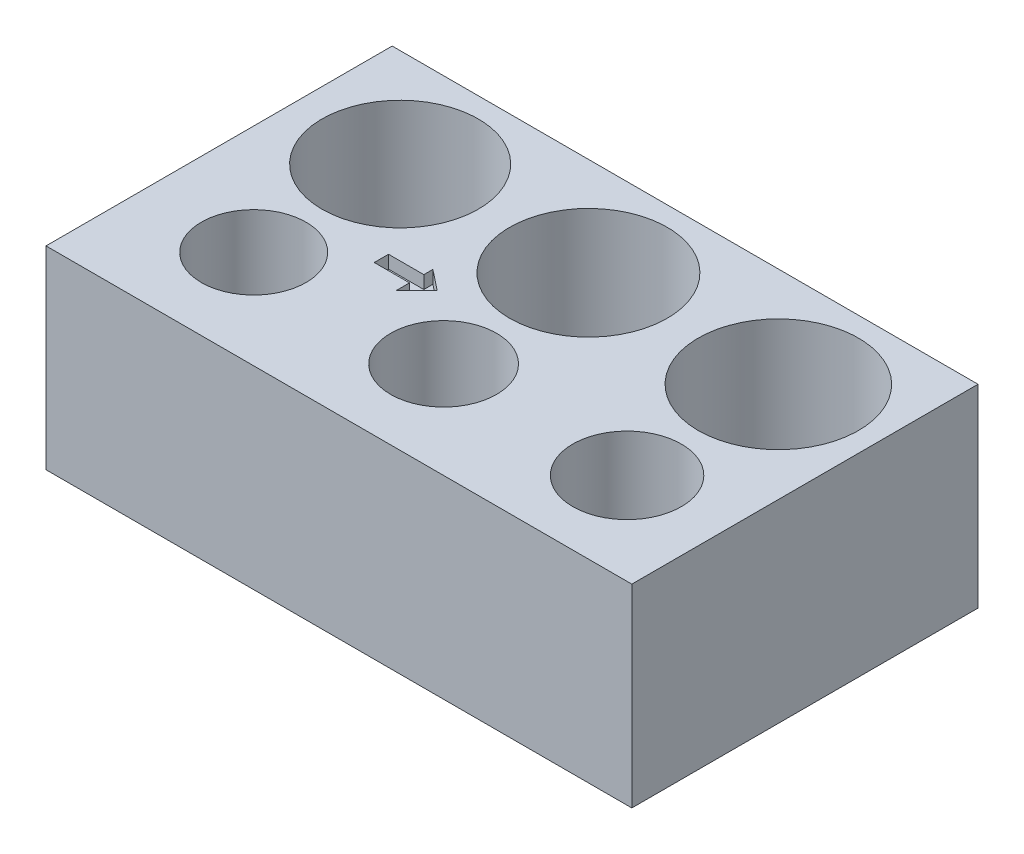
ISO-10303-21;
HEADER;
FILE_DESCRIPTION(('STEP AP214'),'2;1');
FILE_NAME('part.step','',(''),(''),'','','');
FILE_SCHEMA(('AUTOMOTIVE_DESIGN { 1 0 10303 214 1 1 1 1 }'));
ENDSEC;
DATA;
#1=APPLICATION_CONTEXT('core data for automotive mechanical design processes');
#2=APPLICATION_PROTOCOL_DEFINITION('international standard','automotive_design',2000,#1);
#3=PRODUCT_CONTEXT('',#1,'mechanical');
#4=PRODUCT('Part','Part','',(#3));
#5=PRODUCT_RELATED_PRODUCT_CATEGORY('part','',(#4));
#6=PRODUCT_DEFINITION_FORMATION('','',#4);
#7=PRODUCT_DEFINITION_CONTEXT('part definition',#1,'design');
#8=PRODUCT_DEFINITION('design','',#6,#7);
#9=PRODUCT_DEFINITION_SHAPE('','',#8);
#10=(LENGTH_UNIT() NAMED_UNIT(*) SI_UNIT(.MILLI.,.METRE.));
#11=(NAMED_UNIT(*) PLANE_ANGLE_UNIT() SI_UNIT($,.RADIAN.));
#12=(NAMED_UNIT(*) SI_UNIT($,.STERADIAN.) SOLID_ANGLE_UNIT());
#13=UNCERTAINTY_MEASURE_WITH_UNIT(LENGTH_MEASURE(1.E-05),#10,'distance_accuracy_value','');
#14=(GEOMETRIC_REPRESENTATION_CONTEXT(3) GLOBAL_UNCERTAINTY_ASSIGNED_CONTEXT((#13)) GLOBAL_UNIT_ASSIGNED_CONTEXT((#10,
#11,#12)) REPRESENTATION_CONTEXT('',''));
#15=CARTESIAN_POINT('',(0.,0.,0.));
#16=DIRECTION('',(0.,0.,1.));
#17=DIRECTION('',(1.,0.,0.));
#18=AXIS2_PLACEMENT_3D('',#15,#16,#17);
#19=CARTESIAN_POINT('',(0.,15.,0.));
#20=DIRECTION('',(0.,1.,0.));
#21=DIRECTION('',(0.,0.,1.));
#22=AXIS2_PLACEMENT_3D('',#19,#20,#21);
#23=PLANE('',#22);
#24=DIRECTION('',(0.,0.,1.));
#25=VECTOR('',#24,1.);
#26=CARTESIAN_POINT('',(-8.85125343626967,15.,0.700724230371301));
#27=LINE('',#26,#25);
#28=CARTESIAN_POINT('',(-8.85125343626967,15.,0.700724230371301));
#29=VERTEX_POINT('',#28);
#30=CARTESIAN_POINT('',(-8.85125343626967,15.,1.80713090990501));
#31=VERTEX_POINT('',#30);
#32=EDGE_CURVE('E48',#29,#31,#27,.T.);
#33=ORIENTED_EDGE('',*,*,#32,.F.);
#34=DIRECTION('',(-1.,0.,0.));
#35=VECTOR('',#34,1.);
#36=CARTESIAN_POINT('',(-8.85125343626967,15.,0.700724230371301));
#37=LINE('',#36,#35);
#38=CARTESIAN_POINT('',(-6.12211696008651,15.,0.700724230371301));
#39=VERTEX_POINT('',#38);
#40=EDGE_CURVE('E146',#39,#29,#37,.T.);
#41=ORIENTED_EDGE('',*,*,#40,.F.);
#42=DIRECTION('',(0.,0.,1.));
#43=VECTOR('',#42,1.);
#44=CARTESIAN_POINT('',(-6.12211696008651,15.,0.));
#45=LINE('',#44,#43);
#46=CARTESIAN_POINT('',(-6.12211696008651,15.,0.));
#47=VERTEX_POINT('',#46);
#48=EDGE_CURVE('E149',#47,#39,#45,.T.);
#49=ORIENTED_EDGE('',*,*,#48,.F.);
#50=DIRECTION('',(-0.784415591570885,0.,-0.620235584032792));
#51=VECTOR('',#50,1.);
#52=CARTESIAN_POINT('',(-4.53626738608826,15.,1.25392757013816));
#53=LINE('',#52,#51);
#54=CARTESIAN_POINT('',(-4.53626738608826,15.,1.25392757013816));
#55=VERTEX_POINT('',#54);
#56=EDGE_CURVE('E171',#55,#47,#53,.T.);
#57=ORIENTED_EDGE('',*,*,#56,.F.);
#58=DIRECTION('',(0.707106781186534,0.,-0.707106781186561));
#59=VECTOR('',#58,1.);
#60=CARTESIAN_POINT('',(-6.12211696008651,15.,2.83977714413647));
#61=LINE('',#60,#59);
#62=CARTESIAN_POINT('',(-6.12211696008651,15.,2.83977714413647));
#63=VERTEX_POINT('',#62);
#64=EDGE_CURVE('E168',#63,#55,#61,.T.);
#65=ORIENTED_EDGE('',*,*,#64,.F.);
#66=DIRECTION('',(0.,0.,1.));
#67=VECTOR('',#66,1.);
#68=CARTESIAN_POINT('',(-6.12211696008651,15.,1.80713090990501));
#69=LINE('',#68,#67);
#70=CARTESIAN_POINT('',(-6.12211696008651,15.,1.80713090990501));
#71=VERTEX_POINT('',#70);
#72=EDGE_CURVE('E165',#71,#63,#69,.T.);
#73=ORIENTED_EDGE('',*,*,#72,.F.);
#74=DIRECTION('',(1.,0.,0.));
#75=VECTOR('',#74,1.);
#76=CARTESIAN_POINT('',(-8.85125343626967,15.,1.80713090990501));
#77=LINE('',#76,#75);
#78=EDGE_CURVE('E163',#31,#71,#77,.T.);
#79=ORIENTED_EDGE('',*,*,#78,.F.);
#80=EDGE_LOOP('',(#33,#41,#49,#57,#65,#73,#79));
#81=FACE_BOUND('',#80,.T.);
#82=CARTESIAN_POINT('',(0.124516231253174,15.,-5.79000475327254));
#83=DIRECTION('',(0.,1.,0.));
#84=DIRECTION('',(0.,0.,1.));
#85=AXIS2_PLACEMENT_3D('',#82,#83,#84);
#86=CIRCLE('',#85,6.1);
#87=CARTESIAN_POINT('',(0.124516231253174,15.,0.309995246727462));
#88=VERTEX_POINT('',#87);
#89=EDGE_CURVE('E194',#88,#88,#86,.T.);
#90=ORIENTED_EDGE('',*,*,#89,.F.);
#91=EDGE_LOOP('',(#90));
#92=FACE_BOUND('',#91,.T.);
#93=CARTESIAN_POINT('',(15.1909802128871,15.,6.28806967828523));
#94=DIRECTION('',(0.,1.,0.));
#95=DIRECTION('',(0.,0.,1.));
#96=AXIS2_PLACEMENT_3D('',#93,#94,#95);
#97=CIRCLE('',#96,4.2);
#98=CARTESIAN_POINT('',(15.1909802128871,15.,10.4880696782852));
#99=VERTEX_POINT('',#98);
#100=EDGE_CURVE('E206',#99,#99,#97,.T.);
#101=ORIENTED_EDGE('',*,*,#100,.F.);
#102=EDGE_LOOP('',(#101));
#103=FACE_BOUND('',#102,.T.);
#104=CARTESIAN_POINT('',(-14.1948503628617,15.,5.79000475327253));
#105=DIRECTION('',(0.,1.,0.));
#106=DIRECTION('',(0.,0.,1.));
#107=AXIS2_PLACEMENT_3D('',#104,#105,#106);
#108=CIRCLE('',#107,4.05);
#109=CARTESIAN_POINT('',(-14.1948503628617,15.,9.84000475327253));
#110=VERTEX_POINT('',#109);
#111=EDGE_CURVE('E218',#110,#110,#108,.T.);
#112=ORIENTED_EDGE('',*,*,#111,.F.);
#113=EDGE_LOOP('',(#112));
#114=FACE_BOUND('',#113,.T.);
#115=DIRECTION('',(0.,0.,-1.));
#116=VECTOR('',#115,1.);
#117=CARTESIAN_POINT('',(22.6619540880774,15.,-13.3917246278051));
#118=LINE('',#117,#116);
#119=CARTESIAN_POINT('',(22.6619540880774,15.,13.3917246278051));
#120=VERTEX_POINT('',#119);
#121=CARTESIAN_POINT('',(22.6619540880774,15.,-13.3917246278051));
#122=VERTEX_POINT('',#121);
#123=EDGE_CURVE('E224',#120,#122,#118,.T.);
#124=ORIENTED_EDGE('',*,*,#123,.T.);
#125=DIRECTION('',(-1.,0.,0.));
#126=VECTOR('',#125,1.);
#127=CARTESIAN_POINT('',(-22.6619540880774,15.,-13.3917246278051));
#128=LINE('',#127,#126);
#129=CARTESIAN_POINT('',(-22.6619540880774,15.,-13.3917246278051));
#130=VERTEX_POINT('',#129);
#131=EDGE_CURVE('E85',#122,#130,#128,.T.);
#132=ORIENTED_EDGE('',*,*,#131,.T.);
#133=DIRECTION('',(0.,0.,1.));
#134=VECTOR('',#133,1.);
#135=CARTESIAN_POINT('',(-22.6619540880774,15.,-13.3917246278051));
#136=LINE('',#135,#134);
#137=CARTESIAN_POINT('',(-22.6619540880774,15.,13.3917246278051));
#138=VERTEX_POINT('',#137);
#139=EDGE_CURVE('E227',#130,#138,#136,.T.);
#140=ORIENTED_EDGE('',*,*,#139,.T.);
#141=DIRECTION('',(1.,0.,0.));
#142=VECTOR('',#141,1.);
#143=CARTESIAN_POINT('',(-22.6619540880774,15.,13.3917246278051));
#144=LINE('',#143,#142);
#145=EDGE_CURVE('E57',#138,#120,#144,.T.);
#146=ORIENTED_EDGE('',*,*,#145,.T.);
#147=EDGE_LOOP('',(#124,#132,#140,#146));
#148=FACE_BOUND('',#147,.T.);
#149=CARTESIAN_POINT('',(0.622581156265872,15.,5.9145209845257));
#150=DIRECTION('',(0.,1.,0.));
#151=DIRECTION('',(0.,0.,1.));
#152=AXIS2_PLACEMENT_3D('',#149,#150,#151);
#153=CIRCLE('',#152,4.1);
#154=CARTESIAN_POINT('',(0.622581156265872,15.,10.0145209845257));
#155=VERTEX_POINT('',#154);
#156=EDGE_CURVE('E212',#155,#155,#153,.T.);
#157=ORIENTED_EDGE('',*,*,#156,.F.);
#158=EDGE_LOOP('',(#157));
#159=FACE_BOUND('',#158,.T.);
#160=CARTESIAN_POINT('',(-14.443882825368,15.,-5.79000475327253));
#161=DIRECTION('',(0.,1.,0.));
#162=DIRECTION('',(0.,0.,1.));
#163=AXIS2_PLACEMENT_3D('',#160,#161,#162);
#164=CIRCLE('',#163,6.05);
#165=CARTESIAN_POINT('',(-14.443882825368,15.,0.259995246727468));
#166=VERTEX_POINT('',#165);
#167=EDGE_CURVE('E200',#166,#166,#164,.T.);
#168=ORIENTED_EDGE('',*,*,#167,.F.);
#169=EDGE_LOOP('',(#168));
#170=FACE_BOUND('',#169,.T.);
#171=CARTESIAN_POINT('',(14.9419477503807,15.,-5.66548852201936));
#172=DIRECTION('',(0.,1.,0.));
#173=DIRECTION('',(0.,0.,1.));
#174=AXIS2_PLACEMENT_3D('',#171,#172,#173);
#175=CIRCLE('',#174,6.2);
#176=CARTESIAN_POINT('',(14.9419477503807,15.,0.534511477980644));
#177=VERTEX_POINT('',#176);
#178=EDGE_CURVE('E188',#177,#177,#175,.T.);
#179=ORIENTED_EDGE('',*,*,#178,.F.);
#180=EDGE_LOOP('',(#179));
#181=FACE_BOUND('',#180,.T.);
#182=ADVANCED_FACE('F33',(#81,#92,#103,#114,#148,#159,#170,#181),#23,.T.);
#183=CARTESIAN_POINT('',(0.,0.,0.));
#184=DIRECTION('',(0.,1.,0.));
#185=DIRECTION('',(0.,0.,1.));
#186=AXIS2_PLACEMENT_3D('',#183,#184,#185);
#187=PLANE('',#186);
#188=DIRECTION('',(0.,0.,-1.));
#189=VECTOR('',#188,1.);
#190=CARTESIAN_POINT('',(22.6619540880774,0.,-13.3917246278051));
#191=LINE('',#190,#189);
#192=CARTESIAN_POINT('',(22.6619540880774,0.,13.3917246278051));
#193=VERTEX_POINT('',#192);
#194=CARTESIAN_POINT('',(22.6619540880774,0.,-13.3917246278051));
#195=VERTEX_POINT('',#194);
#196=EDGE_CURVE('E221',#193,#195,#191,.T.);
#197=ORIENTED_EDGE('',*,*,#196,.F.);
#198=DIRECTION('',(1.,0.,0.));
#199=VECTOR('',#198,1.);
#200=CARTESIAN_POINT('',(-22.6619540880774,0.,13.3917246278051));
#201=LINE('',#200,#199);
#202=CARTESIAN_POINT('',(-22.6619540880774,0.,13.3917246278051));
#203=VERTEX_POINT('',#202);
#204=EDGE_CURVE('E78',#203,#193,#201,.T.);
#205=ORIENTED_EDGE('',*,*,#204,.F.);
#206=DIRECTION('',(0.,0.,1.));
#207=VECTOR('',#206,1.);
#208=CARTESIAN_POINT('',(-22.6619540880774,0.,-13.3917246278051));
#209=LINE('',#208,#207);
#210=CARTESIAN_POINT('',(-22.6619540880774,0.,-13.3917246278051));
#211=VERTEX_POINT('',#210);
#212=EDGE_CURVE('E235',#211,#203,#209,.T.);
#213=ORIENTED_EDGE('',*,*,#212,.F.);
#214=DIRECTION('',(-1.,0.,0.));
#215=VECTOR('',#214,1.);
#216=CARTESIAN_POINT('',(-22.6619540880774,0.,-13.3917246278051));
#217=LINE('',#216,#215);
#218=EDGE_CURVE('E233',#195,#211,#217,.T.);
#219=ORIENTED_EDGE('',*,*,#218,.F.);
#220=EDGE_LOOP('',(#197,#205,#213,#219));
#221=FACE_BOUND('',#220,.T.);
#222=CARTESIAN_POINT('',(-14.1948503628617,0.,5.79000475327253));
#223=DIRECTION('',(0.,1.,0.));
#224=DIRECTION('',(0.,0.,1.));
#225=AXIS2_PLACEMENT_3D('',#222,#223,#224);
#226=CIRCLE('',#225,4.05);
#227=CARTESIAN_POINT('',(-14.1948503628617,0.,9.84000475327253));
#228=VERTEX_POINT('',#227);
#229=EDGE_CURVE('E215',#228,#228,#226,.T.);
#230=ORIENTED_EDGE('',*,*,#229,.T.);
#231=EDGE_LOOP('',(#230));
#232=FACE_BOUND('',#231,.T.);
#233=CARTESIAN_POINT('',(0.622581156265872,0.,5.9145209845257));
#234=DIRECTION('',(0.,1.,0.));
#235=DIRECTION('',(0.,0.,1.));
#236=AXIS2_PLACEMENT_3D('',#233,#234,#235);
#237=CIRCLE('',#236,4.1);
#238=CARTESIAN_POINT('',(0.622581156265872,0.,10.0145209845257));
#239=VERTEX_POINT('',#238);
#240=EDGE_CURVE('E209',#239,#239,#237,.T.);
#241=ORIENTED_EDGE('',*,*,#240,.T.);
#242=EDGE_LOOP('',(#241));
#243=FACE_BOUND('',#242,.T.);
#244=CARTESIAN_POINT('',(15.1909802128871,0.,6.28806967828523));
#245=DIRECTION('',(0.,1.,0.));
#246=DIRECTION('',(0.,0.,1.));
#247=AXIS2_PLACEMENT_3D('',#244,#245,#246);
#248=CIRCLE('',#247,4.2);
#249=CARTESIAN_POINT('',(15.1909802128871,0.,10.4880696782852));
#250=VERTEX_POINT('',#249);
#251=EDGE_CURVE('E203',#250,#250,#248,.T.);
#252=ORIENTED_EDGE('',*,*,#251,.T.);
#253=EDGE_LOOP('',(#252));
#254=FACE_BOUND('',#253,.T.);
#255=CARTESIAN_POINT('',(-14.443882825368,0.,-5.79000475327253));
#256=DIRECTION('',(0.,1.,0.));
#257=DIRECTION('',(0.,0.,1.));
#258=AXIS2_PLACEMENT_3D('',#255,#256,#257);
#259=CIRCLE('',#258,6.05);
#260=CARTESIAN_POINT('',(-14.443882825368,0.,0.259995246727468));
#261=VERTEX_POINT('',#260);
#262=EDGE_CURVE('E197',#261,#261,#259,.T.);
#263=ORIENTED_EDGE('',*,*,#262,.T.);
#264=EDGE_LOOP('',(#263));
#265=FACE_BOUND('',#264,.T.);
#266=CARTESIAN_POINT('',(0.124516231253174,0.,-5.79000475327254));
#267=DIRECTION('',(0.,1.,0.));
#268=DIRECTION('',(0.,0.,1.));
#269=AXIS2_PLACEMENT_3D('',#266,#267,#268);
#270=CIRCLE('',#269,6.1);
#271=CARTESIAN_POINT('',(0.124516231253174,0.,0.309995246727462));
#272=VERTEX_POINT('',#271);
#273=EDGE_CURVE('E191',#272,#272,#270,.T.);
#274=ORIENTED_EDGE('',*,*,#273,.T.);
#275=EDGE_LOOP('',(#274));
#276=FACE_BOUND('',#275,.T.);
#277=CARTESIAN_POINT('',(14.9419477503807,0.,-5.66548852201936));
#278=DIRECTION('',(0.,1.,0.));
#279=DIRECTION('',(0.,0.,1.));
#280=AXIS2_PLACEMENT_3D('',#277,#278,#279);
#281=CIRCLE('',#280,6.2);
#282=CARTESIAN_POINT('',(14.9419477503807,0.,0.534511477980644));
#283=VERTEX_POINT('',#282);
#284=EDGE_CURVE('E178',#283,#283,#281,.T.);
#285=ORIENTED_EDGE('',*,*,#284,.T.);
#286=EDGE_LOOP('',(#285));
#287=FACE_BOUND('',#286,.T.);
#288=ADVANCED_FACE('F248',(#221,#232,#243,#254,#265,#276,#287),#187,.F.);
#289=CARTESIAN_POINT('',(22.6619540880774,15.,-13.3917246278051));
#290=DIRECTION('',(-1.,0.,0.));
#291=DIRECTION('',(0.,0.,1.));
#292=AXIS2_PLACEMENT_3D('',#289,#290,#291);
#293=PLANE('',#292);
#294=ORIENTED_EDGE('',*,*,#196,.T.);
#295=DIRECTION('',(0.,-1.,0.));
#296=VECTOR('',#295,1.);
#297=CARTESIAN_POINT('',(22.6619540880774,15.,-13.3917246278051));
#298=LINE('',#297,#296);
#299=EDGE_CURVE('E11',#122,#195,#298,.T.);
#300=ORIENTED_EDGE('',*,*,#299,.F.);
#301=ORIENTED_EDGE('',*,*,#123,.F.);
#302=DIRECTION('',(0.,-1.,0.));
#303=VECTOR('',#302,1.);
#304=CARTESIAN_POINT('',(22.6619540880774,15.,13.3917246278051));
#305=LINE('',#304,#303);
#306=EDGE_CURVE('E230',#120,#193,#305,.T.);
#307=ORIENTED_EDGE('',*,*,#306,.T.);
#308=EDGE_LOOP('',(#294,#300,#301,#307));
#309=FACE_BOUND('',#308,.T.);
#310=ADVANCED_FACE('F35',(#309),#293,.F.);
#311=CARTESIAN_POINT('',(-22.6619540880774,15.,-13.3917246278051));
#312=DIRECTION('',(0.,0.,1.));
#313=DIRECTION('',(1.,0.,0.));
#314=AXIS2_PLACEMENT_3D('',#311,#312,#313);
#315=PLANE('',#314);
#316=ORIENTED_EDGE('',*,*,#218,.T.);
#317=DIRECTION('',(0.,-1.,0.));
#318=VECTOR('',#317,1.);
#319=CARTESIAN_POINT('',(-22.6619540880774,15.,-13.3917246278051));
#320=LINE('',#319,#318);
#321=EDGE_CURVE('E41',#130,#211,#320,.T.);
#322=ORIENTED_EDGE('',*,*,#321,.F.);
#323=ORIENTED_EDGE('',*,*,#131,.F.);
#324=ORIENTED_EDGE('',*,*,#299,.T.);
#325=EDGE_LOOP('',(#316,#322,#323,#324));
#326=FACE_BOUND('',#325,.T.);
#327=ADVANCED_FACE('F264',(#326),#315,.F.);
#328=CARTESIAN_POINT('',(-22.6619540880774,15.,-13.3917246278051));
#329=DIRECTION('',(1.,0.,0.));
#330=DIRECTION('',(0.,0.,-1.));
#331=AXIS2_PLACEMENT_3D('',#328,#329,#330);
#332=PLANE('',#331);
#333=ORIENTED_EDGE('',*,*,#212,.T.);
#334=DIRECTION('',(0.,-1.,0.));
#335=VECTOR('',#334,1.);
#336=CARTESIAN_POINT('',(-22.6619540880774,15.,13.3917246278051));
#337=LINE('',#336,#335);
#338=EDGE_CURVE('E239',#138,#203,#337,.T.);
#339=ORIENTED_EDGE('',*,*,#338,.F.);
#340=ORIENTED_EDGE('',*,*,#139,.F.);
#341=ORIENTED_EDGE('',*,*,#321,.T.);
#342=EDGE_LOOP('',(#333,#339,#340,#341));
#343=FACE_BOUND('',#342,.T.);
#344=ADVANCED_FACE('F244',(#343),#332,.F.);
#345=CARTESIAN_POINT('',(-22.6619540880774,15.,13.3917246278051));
#346=DIRECTION('',(0.,0.,-1.));
#347=DIRECTION('',(-1.,0.,0.));
#348=AXIS2_PLACEMENT_3D('',#345,#346,#347);
#349=PLANE('',#348);
#350=ORIENTED_EDGE('',*,*,#204,.T.);
#351=ORIENTED_EDGE('',*,*,#306,.F.);
#352=ORIENTED_EDGE('',*,*,#145,.F.);
#353=ORIENTED_EDGE('',*,*,#338,.T.);
#354=EDGE_LOOP('',(#350,#351,#352,#353));
#355=FACE_BOUND('',#354,.T.);
#356=ADVANCED_FACE('F253',(#355),#349,.F.);
#357=CARTESIAN_POINT('',(-14.1948503628617,15.,5.79000475327253));
#358=DIRECTION('',(0.,-1.,0.));
#359=DIRECTION('',(0.,0.,-1.));
#360=AXIS2_PLACEMENT_3D('',#357,#358,#359);
#361=CYLINDRICAL_SURFACE('',#360,4.05);
#362=ORIENTED_EDGE('',*,*,#111,.T.);
#363=EDGE_LOOP('',(#362));
#364=FACE_BOUND('',#363,.T.);
#365=ORIENTED_EDGE('',*,*,#229,.F.);
#366=EDGE_LOOP('',(#365));
#367=FACE_BOUND('',#366,.T.);
#368=ADVANCED_FACE('F255',(#364,#367),#361,.F.);
#369=CARTESIAN_POINT('',(0.622581156265872,15.,5.9145209845257));
#370=DIRECTION('',(0.,-1.,0.));
#371=DIRECTION('',(0.,0.,-1.));
#372=AXIS2_PLACEMENT_3D('',#369,#370,#371);
#373=CYLINDRICAL_SURFACE('',#372,4.1);
#374=ORIENTED_EDGE('',*,*,#156,.T.);
#375=EDGE_LOOP('',(#374));
#376=FACE_BOUND('',#375,.T.);
#377=ORIENTED_EDGE('',*,*,#240,.F.);
#378=EDGE_LOOP('',(#377));
#379=FACE_BOUND('',#378,.T.);
#380=ADVANCED_FACE('F261',(#376,#379),#373,.F.);
#381=CARTESIAN_POINT('',(15.1909802128871,15.,6.28806967828523));
#382=DIRECTION('',(0.,-1.,0.));
#383=DIRECTION('',(0.,0.,-1.));
#384=AXIS2_PLACEMENT_3D('',#381,#382,#383);
#385=CYLINDRICAL_SURFACE('',#384,4.2);
#386=ORIENTED_EDGE('',*,*,#100,.T.);
#387=EDGE_LOOP('',(#386));
#388=FACE_BOUND('',#387,.T.);
#389=ORIENTED_EDGE('',*,*,#251,.F.);
#390=EDGE_LOOP('',(#389));
#391=FACE_BOUND('',#390,.T.);
#392=ADVANCED_FACE('F277',(#388,#391),#385,.F.);
#393=CARTESIAN_POINT('',(-14.443882825368,15.,-5.79000475327253));
#394=DIRECTION('',(0.,-1.,0.));
#395=DIRECTION('',(0.,0.,-1.));
#396=AXIS2_PLACEMENT_3D('',#393,#394,#395);
#397=CYLINDRICAL_SURFACE('',#396,6.05);
#398=ORIENTED_EDGE('',*,*,#167,.T.);
#399=EDGE_LOOP('',(#398));
#400=FACE_BOUND('',#399,.T.);
#401=ORIENTED_EDGE('',*,*,#262,.F.);
#402=EDGE_LOOP('',(#401));
#403=FACE_BOUND('',#402,.T.);
#404=ADVANCED_FACE('F281',(#400,#403),#397,.F.);
#405=CARTESIAN_POINT('',(0.124516231253174,15.,-5.79000475327254));
#406=DIRECTION('',(0.,-1.,0.));
#407=DIRECTION('',(0.,0.,-1.));
#408=AXIS2_PLACEMENT_3D('',#405,#406,#407);
#409=CYLINDRICAL_SURFACE('',#408,6.1);
#410=ORIENTED_EDGE('',*,*,#89,.T.);
#411=EDGE_LOOP('',(#410));
#412=FACE_BOUND('',#411,.T.);
#413=ORIENTED_EDGE('',*,*,#273,.F.);
#414=EDGE_LOOP('',(#413));
#415=FACE_BOUND('',#414,.T.);
#416=ADVANCED_FACE('F285',(#412,#415),#409,.F.);
#417=CARTESIAN_POINT('',(14.9419477503807,15.,-5.66548852201936));
#418=DIRECTION('',(0.,-1.,0.));
#419=DIRECTION('',(0.,0.,-1.));
#420=AXIS2_PLACEMENT_3D('',#417,#418,#419);
#421=CYLINDRICAL_SURFACE('',#420,6.2);
#422=ORIENTED_EDGE('',*,*,#178,.T.);
#423=EDGE_LOOP('',(#422));
#424=FACE_BOUND('',#423,.T.);
#425=ORIENTED_EDGE('',*,*,#284,.F.);
#426=EDGE_LOOP('',(#425));
#427=FACE_BOUND('',#426,.T.);
#428=ADVANCED_FACE('F289',(#424,#427),#421,.F.);
#429=CARTESIAN_POINT('',(-8.85125343626967,14.,0.700724230371301));
#430=DIRECTION('',(-1.,0.,0.));
#431=DIRECTION('',(0.,0.,1.));
#432=AXIS2_PLACEMENT_3D('',#429,#430,#431);
#433=PLANE('',#432);
#434=ORIENTED_EDGE('',*,*,#32,.T.);
#435=DIRECTION('',(0.,1.,0.));
#436=VECTOR('',#435,1.);
#437=CARTESIAN_POINT('',(-8.85125343626967,14.,1.80713090990501));
#438=LINE('',#437,#436);
#439=CARTESIAN_POINT('',(-8.85125343626967,14.,1.80713090990501));
#440=VERTEX_POINT('',#439);
#441=EDGE_CURVE('E123',#440,#31,#438,.T.);
#442=ORIENTED_EDGE('',*,*,#441,.F.);
#443=DIRECTION('',(0.,0.,1.));
#444=VECTOR('',#443,1.);
#445=CARTESIAN_POINT('',(-8.85125343626967,14.,0.700724230371301));
#446=LINE('',#445,#444);
#447=CARTESIAN_POINT('',(-8.85125343626967,14.,0.700724230371301));
#448=VERTEX_POINT('',#447);
#449=EDGE_CURVE('E127',#448,#440,#446,.T.);
#450=ORIENTED_EDGE('',*,*,#449,.F.);
#451=DIRECTION('',(0.,1.,0.));
#452=VECTOR('',#451,1.);
#453=CARTESIAN_POINT('',(-8.85125343626967,14.,0.700724230371301));
#454=LINE('',#453,#452);
#455=EDGE_CURVE('E176',#448,#29,#454,.T.);
#456=ORIENTED_EDGE('',*,*,#455,.T.);
#457=EDGE_LOOP('',(#434,#442,#450,#456));
#458=FACE_BOUND('',#457,.T.);
#459=ADVANCED_FACE('F125',(#458),#433,.F.);
#460=CARTESIAN_POINT('',(-8.85125343626967,14.,0.700724230371301));
#461=DIRECTION('',(0.,0.,-1.));
#462=DIRECTION('',(-1.,0.,0.));
#463=AXIS2_PLACEMENT_3D('',#460,#461,#462);
#464=PLANE('',#463);
#465=ORIENTED_EDGE('',*,*,#40,.T.);
#466=ORIENTED_EDGE('',*,*,#455,.F.);
#467=DIRECTION('',(-1.,0.,0.));
#468=VECTOR('',#467,1.);
#469=CARTESIAN_POINT('',(-8.85125343626967,14.,0.700724230371301));
#470=LINE('',#469,#468);
#471=CARTESIAN_POINT('',(-6.12211696008651,14.,0.700724230371301));
#472=VERTEX_POINT('',#471);
#473=EDGE_CURVE('E133',#472,#448,#470,.T.);
#474=ORIENTED_EDGE('',*,*,#473,.F.);
#475=DIRECTION('',(0.,1.,0.));
#476=VECTOR('',#475,1.);
#477=CARTESIAN_POINT('',(-6.12211696008651,14.,0.700724230371301));
#478=LINE('',#477,#476);
#479=EDGE_CURVE('E179',#472,#39,#478,.T.);
#480=ORIENTED_EDGE('',*,*,#479,.T.);
#481=EDGE_LOOP('',(#465,#466,#474,#480));
#482=FACE_BOUND('',#481,.T.);
#483=ADVANCED_FACE('F296',(#482),#464,.F.);
#484=CARTESIAN_POINT('',(-6.12211696008651,14.,0.));
#485=DIRECTION('',(-1.,0.,0.));
#486=DIRECTION('',(0.,0.,1.));
#487=AXIS2_PLACEMENT_3D('',#484,#485,#486);
#488=PLANE('',#487);
#489=ORIENTED_EDGE('',*,*,#48,.T.);
#490=ORIENTED_EDGE('',*,*,#479,.F.);
#491=DIRECTION('',(0.,0.,1.));
#492=VECTOR('',#491,1.);
#493=CARTESIAN_POINT('',(-6.12211696008651,14.,0.));
#494=LINE('',#493,#492);
#495=CARTESIAN_POINT('',(-6.12211696008651,14.,0.));
#496=VERTEX_POINT('',#495);
#497=EDGE_CURVE('E159',#496,#472,#494,.T.);
#498=ORIENTED_EDGE('',*,*,#497,.F.);
#499=DIRECTION('',(0.,1.,0.));
#500=VECTOR('',#499,1.);
#501=CARTESIAN_POINT('',(-6.12211696008651,14.,0.));
#502=LINE('',#501,#500);
#503=EDGE_CURVE('E181',#496,#47,#502,.T.);
#504=ORIENTED_EDGE('',*,*,#503,.T.);
#505=EDGE_LOOP('',(#489,#490,#498,#504));
#506=FACE_BOUND('',#505,.T.);
#507=ADVANCED_FACE('F310',(#506),#488,.F.);
#508=CARTESIAN_POINT('',(-4.53626738608826,14.,1.25392757013816));
#509=DIRECTION('',(0.620235584032792,0.,-0.784415591570885));
#510=DIRECTION('',(-0.784415591570885,0.,-0.620235584032792));
#511=AXIS2_PLACEMENT_3D('',#508,#509,#510);
#512=PLANE('',#511);
#513=ORIENTED_EDGE('',*,*,#56,.T.);
#514=ORIENTED_EDGE('',*,*,#503,.F.);
#515=DIRECTION('',(-0.784415591570885,0.,-0.620235584032792));
#516=VECTOR('',#515,1.);
#517=CARTESIAN_POINT('',(-4.53626738608826,14.,1.25392757013816));
#518=LINE('',#517,#516);
#519=CARTESIAN_POINT('',(-4.53626738608826,14.,1.25392757013816));
#520=VERTEX_POINT('',#519);
#521=EDGE_CURVE('E156',#520,#496,#518,.T.);
#522=ORIENTED_EDGE('',*,*,#521,.F.);
#523=DIRECTION('',(0.,1.,0.));
#524=VECTOR('',#523,1.);
#525=CARTESIAN_POINT('',(-4.53626738608826,14.,1.25392757013816));
#526=LINE('',#525,#524);
#527=EDGE_CURVE('E183',#520,#55,#526,.T.);
#528=ORIENTED_EDGE('',*,*,#527,.T.);
#529=EDGE_LOOP('',(#513,#514,#522,#528));
#530=FACE_BOUND('',#529,.T.);
#531=ADVANCED_FACE('F306',(#530),#512,.F.);
#532=CARTESIAN_POINT('',(-6.12211696008651,14.,2.83977714413647));
#533=DIRECTION('',(0.707106781186561,0.,0.707106781186534));
#534=DIRECTION('',(0.707106781186534,0.,-0.707106781186561));
#535=AXIS2_PLACEMENT_3D('',#532,#533,#534);
#536=PLANE('',#535);
#537=ORIENTED_EDGE('',*,*,#64,.T.);
#538=ORIENTED_EDGE('',*,*,#527,.F.);
#539=DIRECTION('',(0.707106781186534,0.,-0.707106781186561));
#540=VECTOR('',#539,1.);
#541=CARTESIAN_POINT('',(-6.12211696008651,14.,2.83977714413647));
#542=LINE('',#541,#540);
#543=CARTESIAN_POINT('',(-6.12211696008651,14.,2.83977714413647));
#544=VERTEX_POINT('',#543);
#545=EDGE_CURVE('E153',#544,#520,#542,.T.);
#546=ORIENTED_EDGE('',*,*,#545,.F.);
#547=DIRECTION('',(0.,1.,0.));
#548=VECTOR('',#547,1.);
#549=CARTESIAN_POINT('',(-6.12211696008651,14.,2.83977714413647));
#550=LINE('',#549,#548);
#551=EDGE_CURVE('E185',#544,#63,#550,.T.);
#552=ORIENTED_EDGE('',*,*,#551,.T.);
#553=EDGE_LOOP('',(#537,#538,#546,#552));
#554=FACE_BOUND('',#553,.T.);
#555=ADVANCED_FACE('F302',(#554),#536,.F.);
#556=CARTESIAN_POINT('',(-6.12211696008651,14.,1.80713090990501));
#557=DIRECTION('',(-1.,0.,0.));
#558=DIRECTION('',(0.,0.,1.));
#559=AXIS2_PLACEMENT_3D('',#556,#557,#558);
#560=PLANE('',#559);
#561=ORIENTED_EDGE('',*,*,#72,.T.);
#562=ORIENTED_EDGE('',*,*,#551,.F.);
#563=DIRECTION('',(0.,0.,1.));
#564=VECTOR('',#563,1.);
#565=CARTESIAN_POINT('',(-6.12211696008651,14.,1.80713090990501));
#566=LINE('',#565,#564);
#567=CARTESIAN_POINT('',(-6.12211696008651,14.,1.80713090990501));
#568=VERTEX_POINT('',#567);
#569=EDGE_CURVE('E141',#568,#544,#566,.T.);
#570=ORIENTED_EDGE('',*,*,#569,.F.);
#571=DIRECTION('',(0.,1.,0.));
#572=VECTOR('',#571,1.);
#573=CARTESIAN_POINT('',(-6.12211696008651,14.,1.80713090990501));
#574=LINE('',#573,#572);
#575=EDGE_CURVE('E132',#568,#71,#574,.T.);
#576=ORIENTED_EDGE('',*,*,#575,.T.);
#577=EDGE_LOOP('',(#561,#562,#570,#576));
#578=FACE_BOUND('',#577,.T.);
#579=ADVANCED_FACE('F299',(#578),#560,.F.);
#580=CARTESIAN_POINT('',(-8.85125343626967,14.,1.80713090990501));
#581=DIRECTION('',(0.,0.,1.));
#582=DIRECTION('',(1.,0.,0.));
#583=AXIS2_PLACEMENT_3D('',#580,#581,#582);
#584=PLANE('',#583);
#585=ORIENTED_EDGE('',*,*,#78,.T.);
#586=ORIENTED_EDGE('',*,*,#575,.F.);
#587=DIRECTION('',(1.,0.,0.));
#588=VECTOR('',#587,1.);
#589=CARTESIAN_POINT('',(-8.85125343626967,14.,1.80713090990501));
#590=LINE('',#589,#588);
#591=EDGE_CURVE('E136',#440,#568,#590,.T.);
#592=ORIENTED_EDGE('',*,*,#591,.F.);
#593=ORIENTED_EDGE('',*,*,#441,.T.);
#594=EDGE_LOOP('',(#585,#586,#592,#593));
#595=FACE_BOUND('',#594,.T.);
#596=ADVANCED_FACE('F137',(#595),#584,.F.);
#597=CARTESIAN_POINT('',(0.,14.,0.));
#598=DIRECTION('',(0.,1.,0.));
#599=DIRECTION('',(0.,0.,1.));
#600=AXIS2_PLACEMENT_3D('',#597,#598,#599);
#601=PLANE('',#600);
#602=ORIENTED_EDGE('',*,*,#449,.T.);
#603=ORIENTED_EDGE('',*,*,#591,.T.);
#604=ORIENTED_EDGE('',*,*,#569,.T.);
#605=ORIENTED_EDGE('',*,*,#545,.T.);
#606=ORIENTED_EDGE('',*,*,#521,.T.);
#607=ORIENTED_EDGE('',*,*,#497,.T.);
#608=ORIENTED_EDGE('',*,*,#473,.T.);
#609=EDGE_LOOP('',(#602,#603,#604,#605,#606,#607,#608));
#610=FACE_BOUND('',#609,.T.);
#611=ADVANCED_FACE('F143',(#610),#601,.T.);
#612=CLOSED_SHELL('',(#182,#288,#310,#327,#344,#356,#368,#380,#392,#404,#416,#428,#459,#483,
#507,#531,#555,#579,#596,#611));
#613=MANIFOLD_SOLID_BREP('B2',#612);
#614=ADVANCED_BREP_SHAPE_REPRESENTATION('',(#18,#613),#14);
#615=SHAPE_DEFINITION_REPRESENTATION(#9,#614);
ENDSEC;
END-ISO-10303-21;
